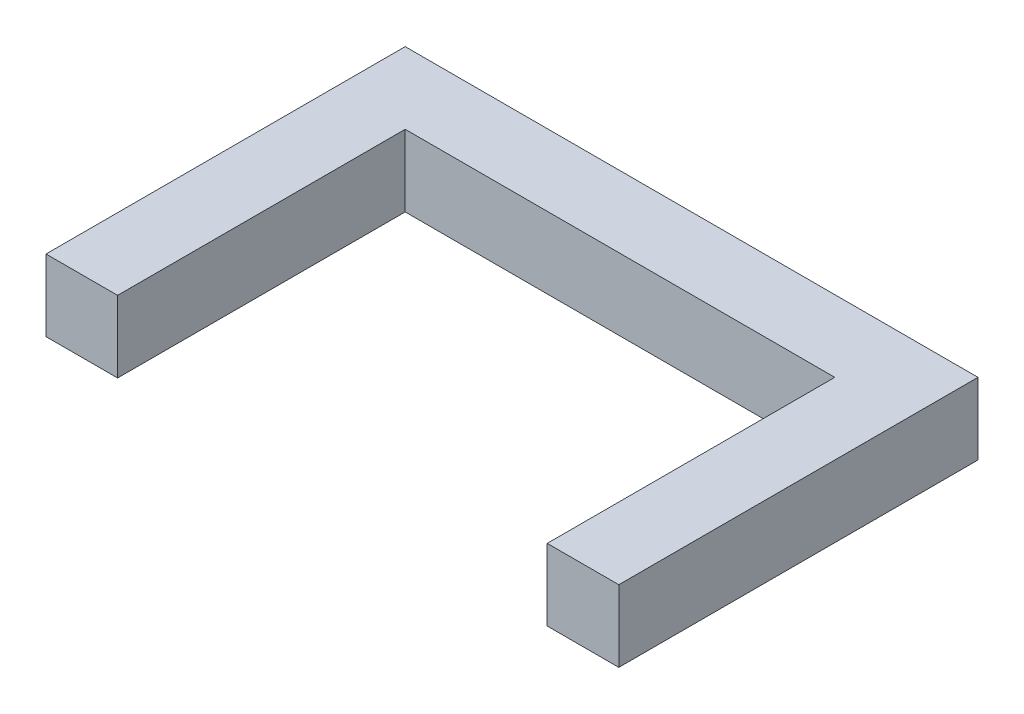
ISO-10303-21;
HEADER;
FILE_DESCRIPTION(('STEP AP214'),'2;1');
FILE_NAME('part.step','',(''),(''),'','','');
FILE_SCHEMA(('AUTOMOTIVE_DESIGN { 1 0 10303 214 1 1 1 1 }'));
ENDSEC;
DATA;
#1=APPLICATION_CONTEXT('core data for automotive mechanical design processes');
#2=APPLICATION_PROTOCOL_DEFINITION('international standard','automotive_design',2000,#1);
#3=PRODUCT_CONTEXT('',#1,'mechanical');
#4=PRODUCT('Part','Part','',(#3));
#5=PRODUCT_RELATED_PRODUCT_CATEGORY('part','',(#4));
#6=PRODUCT_DEFINITION_FORMATION('','',#4);
#7=PRODUCT_DEFINITION_CONTEXT('part definition',#1,'design');
#8=PRODUCT_DEFINITION('design','',#6,#7);
#9=PRODUCT_DEFINITION_SHAPE('','',#8);
#10=(LENGTH_UNIT() NAMED_UNIT(*) SI_UNIT(.MILLI.,.METRE.));
#11=(NAMED_UNIT(*) PLANE_ANGLE_UNIT() SI_UNIT($,.RADIAN.));
#12=(NAMED_UNIT(*) SI_UNIT($,.STERADIAN.) SOLID_ANGLE_UNIT());
#13=UNCERTAINTY_MEASURE_WITH_UNIT(LENGTH_MEASURE(1.E-05),#10,'distance_accuracy_value','');
#14=(GEOMETRIC_REPRESENTATION_CONTEXT(3) GLOBAL_UNCERTAINTY_ASSIGNED_CONTEXT((#13)) GLOBAL_UNIT_ASSIGNED_CONTEXT((#10,
#11,#12)) REPRESENTATION_CONTEXT('',''));
#15=CARTESIAN_POINT('',(0.,0.,0.));
#16=DIRECTION('',(0.,0.,1.));
#17=DIRECTION('',(1.,0.,0.));
#18=AXIS2_PLACEMENT_3D('',#15,#16,#17);
#19=CARTESIAN_POINT('',(4.,4.,0.));
#20=DIRECTION('',(0.,0.,-1.));
#21=DIRECTION('',(-1.,0.,0.));
#22=AXIS2_PLACEMENT_3D('',#19,#20,#21);
#23=PLANE('',#22);
#24=DIRECTION('',(1.,0.,0.));
#25=VECTOR('',#24,1.);
#26=CARTESIAN_POINT('',(4.,0.,0.));
#27=LINE('',#26,#25);
#28=CARTESIAN_POINT('',(0.,0.,0.));
#29=VERTEX_POINT('',#28);
#30=CARTESIAN_POINT('',(4.,0.,0.));
#31=VERTEX_POINT('',#30);
#32=EDGE_CURVE('E134',#29,#31,#27,.T.);
#33=ORIENTED_EDGE('',*,*,#32,.T.);
#34=DIRECTION('',(0.,-1.,0.));
#35=VECTOR('',#34,1.);
#36=CARTESIAN_POINT('',(4.,4.,0.));
#37=LINE('',#36,#35);
#38=CARTESIAN_POINT('',(4.,4.,0.));
#39=VERTEX_POINT('',#38);
#40=EDGE_CURVE('E11',#39,#31,#37,.T.);
#41=ORIENTED_EDGE('',*,*,#40,.F.);
#42=DIRECTION('',(1.,0.,0.));
#43=VECTOR('',#42,1.);
#44=CARTESIAN_POINT('',(4.,4.,0.));
#45=LINE('',#44,#43);
#46=CARTESIAN_POINT('',(0.,4.,0.));
#47=VERTEX_POINT('',#46);
#48=EDGE_CURVE('E146',#47,#39,#45,.T.);
#49=ORIENTED_EDGE('',*,*,#48,.F.);
#50=DIRECTION('',(0.,-1.,0.));
#51=VECTOR('',#50,1.);
#52=CARTESIAN_POINT('',(0.,4.,0.));
#53=LINE('',#52,#51);
#54=EDGE_CURVE('E131',#47,#29,#53,.T.);
#55=ORIENTED_EDGE('',*,*,#54,.T.);
#56=EDGE_LOOP('',(#33,#41,#49,#55));
#57=FACE_BOUND('',#56,.T.);
#58=ADVANCED_FACE('F39',(#57),#23,.F.);
#59=CARTESIAN_POINT('',(4.,4.,-16.066));
#60=DIRECTION('',(-1.,0.,0.));
#61=DIRECTION('',(0.,0.,1.));
#62=AXIS2_PLACEMENT_3D('',#59,#60,#61);
#63=PLANE('',#62);
#64=DIRECTION('',(0.,0.,-1.));
#65=VECTOR('',#64,1.);
#66=CARTESIAN_POINT('',(4.,0.,-16.066));
#67=LINE('',#66,#65);
#68=CARTESIAN_POINT('',(4.,0.,-16.066));
#69=VERTEX_POINT('',#68);
#70=EDGE_CURVE('E138',#31,#69,#67,.T.);
#71=ORIENTED_EDGE('',*,*,#70,.T.);
#72=DIRECTION('',(0.,-1.,0.));
#73=VECTOR('',#72,1.);
#74=CARTESIAN_POINT('',(4.,4.,-16.066));
#75=LINE('',#74,#73);
#76=CARTESIAN_POINT('',(4.,4.,-16.066));
#77=VERTEX_POINT('',#76);
#78=EDGE_CURVE('E50',#77,#69,#75,.T.);
#79=ORIENTED_EDGE('',*,*,#78,.F.);
#80=DIRECTION('',(0.,0.,-1.));
#81=VECTOR('',#80,1.);
#82=CARTESIAN_POINT('',(4.,4.,-16.066));
#83=LINE('',#82,#81);
#84=EDGE_CURVE('E97',#39,#77,#83,.T.);
#85=ORIENTED_EDGE('',*,*,#84,.F.);
#86=ORIENTED_EDGE('',*,*,#40,.T.);
#87=EDGE_LOOP('',(#71,#79,#85,#86));
#88=FACE_BOUND('',#87,.T.);
#89=ADVANCED_FACE('F182',(#88),#63,.F.);
#90=CARTESIAN_POINT('',(28.,4.,-16.066));
#91=DIRECTION('',(0.,0.,-1.));
#92=DIRECTION('',(-1.,0.,0.));
#93=AXIS2_PLACEMENT_3D('',#90,#91,#92);
#94=PLANE('',#93);
#95=DIRECTION('',(1.,0.,0.));
#96=VECTOR('',#95,1.);
#97=CARTESIAN_POINT('',(28.,0.,-16.066));
#98=LINE('',#97,#96);
#99=CARTESIAN_POINT('',(28.,0.,-16.066));
#100=VERTEX_POINT('',#99);
#101=EDGE_CURVE('E139',#69,#100,#98,.T.);
#102=ORIENTED_EDGE('',*,*,#101,.T.);
#103=DIRECTION('',(0.,-1.,0.));
#104=VECTOR('',#103,1.);
#105=CARTESIAN_POINT('',(28.,4.,-16.066));
#106=LINE('',#105,#104);
#107=CARTESIAN_POINT('',(28.,4.,-16.066));
#108=VERTEX_POINT('',#107);
#109=EDGE_CURVE('E157',#108,#100,#106,.T.);
#110=ORIENTED_EDGE('',*,*,#109,.F.);
#111=DIRECTION('',(1.,0.,0.));
#112=VECTOR('',#111,1.);
#113=CARTESIAN_POINT('',(28.,4.,-16.066));
#114=LINE('',#113,#112);
#115=EDGE_CURVE('E163',#77,#108,#114,.T.);
#116=ORIENTED_EDGE('',*,*,#115,.F.);
#117=ORIENTED_EDGE('',*,*,#78,.T.);
#118=EDGE_LOOP('',(#102,#110,#116,#117));
#119=FACE_BOUND('',#118,.T.);
#120=ADVANCED_FACE('F162',(#119),#94,.F.);
#121=CARTESIAN_POINT('',(28.,4.,0.));
#122=DIRECTION('',(1.,0.,0.));
#123=DIRECTION('',(0.,0.,-1.));
#124=AXIS2_PLACEMENT_3D('',#121,#122,#123);
#125=PLANE('',#124);
#126=DIRECTION('',(0.,0.,1.));
#127=VECTOR('',#126,1.);
#128=CARTESIAN_POINT('',(28.,0.,0.));
#129=LINE('',#128,#127);
#130=CARTESIAN_POINT('',(28.,0.,0.));
#131=VERTEX_POINT('',#130);
#132=EDGE_CURVE('E145',#100,#131,#129,.T.);
#133=ORIENTED_EDGE('',*,*,#132,.T.);
#134=DIRECTION('',(0.,-1.,0.));
#135=VECTOR('',#134,1.);
#136=CARTESIAN_POINT('',(28.,4.,0.));
#137=LINE('',#136,#135);
#138=CARTESIAN_POINT('',(28.,4.,0.));
#139=VERTEX_POINT('',#138);
#140=EDGE_CURVE('E154',#139,#131,#137,.T.);
#141=ORIENTED_EDGE('',*,*,#140,.F.);
#142=DIRECTION('',(0.,0.,1.));
#143=VECTOR('',#142,1.);
#144=CARTESIAN_POINT('',(28.,4.,0.));
#145=LINE('',#144,#143);
#146=EDGE_CURVE('E176',#108,#139,#145,.T.);
#147=ORIENTED_EDGE('',*,*,#146,.F.);
#148=ORIENTED_EDGE('',*,*,#109,.T.);
#149=EDGE_LOOP('',(#133,#141,#147,#148));
#150=FACE_BOUND('',#149,.T.);
#151=ADVANCED_FACE('F175',(#150),#125,.F.);
#152=CARTESIAN_POINT('',(32.,4.,0.));
#153=DIRECTION('',(0.,0.,-1.));
#154=DIRECTION('',(-1.,0.,0.));
#155=AXIS2_PLACEMENT_3D('',#152,#153,#154);
#156=PLANE('',#155);
#157=DIRECTION('',(1.,0.,0.));
#158=VECTOR('',#157,1.);
#159=CARTESIAN_POINT('',(32.,0.,0.));
#160=LINE('',#159,#158);
#161=CARTESIAN_POINT('',(32.,0.,0.));
#162=VERTEX_POINT('',#161);
#163=EDGE_CURVE('E143',#131,#162,#160,.T.);
#164=ORIENTED_EDGE('',*,*,#163,.T.);
#165=DIRECTION('',(0.,-1.,0.));
#166=VECTOR('',#165,1.);
#167=CARTESIAN_POINT('',(32.,4.,0.));
#168=LINE('',#167,#166);
#169=CARTESIAN_POINT('',(32.,4.,0.));
#170=VERTEX_POINT('',#169);
#171=EDGE_CURVE('E128',#170,#162,#168,.T.);
#172=ORIENTED_EDGE('',*,*,#171,.F.);
#173=DIRECTION('',(1.,0.,0.));
#174=VECTOR('',#173,1.);
#175=CARTESIAN_POINT('',(32.,4.,0.));
#176=LINE('',#175,#174);
#177=EDGE_CURVE('E117',#139,#170,#176,.T.);
#178=ORIENTED_EDGE('',*,*,#177,.F.);
#179=ORIENTED_EDGE('',*,*,#140,.T.);
#180=EDGE_LOOP('',(#164,#172,#178,#179));
#181=FACE_BOUND('',#180,.T.);
#182=ADVANCED_FACE('F172',(#181),#156,.F.);
#183=CARTESIAN_POINT('',(32.,4.,-20.066));
#184=DIRECTION('',(-1.,0.,0.));
#185=DIRECTION('',(0.,0.,1.));
#186=AXIS2_PLACEMENT_3D('',#183,#184,#185);
#187=PLANE('',#186);
#188=DIRECTION('',(0.,0.,-1.));
#189=VECTOR('',#188,1.);
#190=CARTESIAN_POINT('',(32.,0.,-20.066));
#191=LINE('',#190,#189);
#192=CARTESIAN_POINT('',(32.,0.,-20.066));
#193=VERTEX_POINT('',#192);
#194=EDGE_CURVE('E124',#162,#193,#191,.T.);
#195=ORIENTED_EDGE('',*,*,#194,.T.);
#196=DIRECTION('',(0.,-1.,0.));
#197=VECTOR('',#196,1.);
#198=CARTESIAN_POINT('',(32.,4.,-20.066));
#199=LINE('',#198,#197);
#200=CARTESIAN_POINT('',(32.,4.,-20.066));
#201=VERTEX_POINT('',#200);
#202=EDGE_CURVE('E122',#201,#193,#199,.T.);
#203=ORIENTED_EDGE('',*,*,#202,.F.);
#204=DIRECTION('',(0.,0.,-1.));
#205=VECTOR('',#204,1.);
#206=CARTESIAN_POINT('',(32.,4.,-20.066));
#207=LINE('',#206,#205);
#208=EDGE_CURVE('E112',#170,#201,#207,.T.);
#209=ORIENTED_EDGE('',*,*,#208,.F.);
#210=ORIENTED_EDGE('',*,*,#171,.T.);
#211=EDGE_LOOP('',(#195,#203,#209,#210));
#212=FACE_BOUND('',#211,.T.);
#213=ADVANCED_FACE('F121',(#212),#187,.F.);
#214=CARTESIAN_POINT('',(0.,4.,-20.066));
#215=DIRECTION('',(0.,0.,1.));
#216=DIRECTION('',(1.,0.,0.));
#217=AXIS2_PLACEMENT_3D('',#214,#215,#216);
#218=PLANE('',#217);
#219=DIRECTION('',(-1.,0.,0.));
#220=VECTOR('',#219,1.);
#221=CARTESIAN_POINT('',(0.,0.,-20.066));
#222=LINE('',#221,#220);
#223=CARTESIAN_POINT('',(0.,0.,-20.066));
#224=VERTEX_POINT('',#223);
#225=EDGE_CURVE('E84',#193,#224,#222,.T.);
#226=ORIENTED_EDGE('',*,*,#225,.T.);
#227=DIRECTION('',(0.,-1.,0.));
#228=VECTOR('',#227,1.);
#229=CARTESIAN_POINT('',(0.,4.,-20.066));
#230=LINE('',#229,#228);
#231=CARTESIAN_POINT('',(0.,4.,-20.066));
#232=VERTEX_POINT('',#231);
#233=EDGE_CURVE('E130',#232,#224,#230,.T.);
#234=ORIENTED_EDGE('',*,*,#233,.F.);
#235=DIRECTION('',(-1.,0.,0.));
#236=VECTOR('',#235,1.);
#237=CARTESIAN_POINT('',(0.,4.,-20.066));
#238=LINE('',#237,#236);
#239=EDGE_CURVE('E113',#201,#232,#238,.T.);
#240=ORIENTED_EDGE('',*,*,#239,.F.);
#241=ORIENTED_EDGE('',*,*,#202,.T.);
#242=EDGE_LOOP('',(#226,#234,#240,#241));
#243=FACE_BOUND('',#242,.T.);
#244=ADVANCED_FACE('F129',(#243),#218,.F.);
#245=CARTESIAN_POINT('',(0.,4.,0.));
#246=DIRECTION('',(1.,0.,0.));
#247=DIRECTION('',(0.,0.,-1.));
#248=AXIS2_PLACEMENT_3D('',#245,#246,#247);
#249=PLANE('',#248);
#250=DIRECTION('',(0.,0.,1.));
#251=VECTOR('',#250,1.);
#252=CARTESIAN_POINT('',(0.,0.,0.));
#253=LINE('',#252,#251);
#254=EDGE_CURVE('E89',#224,#29,#253,.T.);
#255=ORIENTED_EDGE('',*,*,#254,.T.);
#256=ORIENTED_EDGE('',*,*,#54,.F.);
#257=DIRECTION('',(0.,0.,1.));
#258=VECTOR('',#257,1.);
#259=CARTESIAN_POINT('',(0.,4.,0.));
#260=LINE('',#259,#258);
#261=EDGE_CURVE('E54',#232,#47,#260,.T.);
#262=ORIENTED_EDGE('',*,*,#261,.F.);
#263=ORIENTED_EDGE('',*,*,#233,.T.);
#264=EDGE_LOOP('',(#255,#256,#262,#263));
#265=FACE_BOUND('',#264,.T.);
#266=ADVANCED_FACE('F200',(#265),#249,.F.);
#267=CARTESIAN_POINT('',(0.,4.,0.));
#268=DIRECTION('',(0.,-1.,0.));
#269=DIRECTION('',(0.,0.,-1.));
#270=AXIS2_PLACEMENT_3D('',#267,#268,#269);
#271=PLANE('',#270);
#272=ORIENTED_EDGE('',*,*,#48,.T.);
#273=ORIENTED_EDGE('',*,*,#84,.T.);
#274=ORIENTED_EDGE('',*,*,#115,.T.);
#275=ORIENTED_EDGE('',*,*,#146,.T.);
#276=ORIENTED_EDGE('',*,*,#177,.T.);
#277=ORIENTED_EDGE('',*,*,#208,.T.);
#278=ORIENTED_EDGE('',*,*,#239,.T.);
#279=ORIENTED_EDGE('',*,*,#261,.T.);
#280=EDGE_LOOP('',(#272,#273,#274,#275,#276,#277,#278,#279));
#281=FACE_BOUND('',#280,.T.);
#282=ADVANCED_FACE('F111',(#281),#271,.F.);
#283=CARTESIAN_POINT('',(0.,0.,0.));
#284=DIRECTION('',(0.,-1.,0.));
#285=DIRECTION('',(0.,0.,-1.));
#286=AXIS2_PLACEMENT_3D('',#283,#284,#285);
#287=PLANE('',#286);
#288=ORIENTED_EDGE('',*,*,#32,.F.);
#289=ORIENTED_EDGE('',*,*,#254,.F.);
#290=ORIENTED_EDGE('',*,*,#225,.F.);
#291=ORIENTED_EDGE('',*,*,#194,.F.);
#292=ORIENTED_EDGE('',*,*,#163,.F.);
#293=ORIENTED_EDGE('',*,*,#132,.F.);
#294=ORIENTED_EDGE('',*,*,#101,.F.);
#295=ORIENTED_EDGE('',*,*,#70,.F.);
#296=EDGE_LOOP('',(#288,#289,#290,#291,#292,#293,#294,#295));
#297=FACE_BOUND('',#296,.T.);
#298=ADVANCED_FACE('F166',(#297),#287,.T.);
#299=CLOSED_SHELL('',(#58,#89,#120,#151,#182,#213,#244,#266,#282,#298));
#300=MANIFOLD_SOLID_BREP('B2',#299);
#301=ADVANCED_BREP_SHAPE_REPRESENTATION('',(#18,#300),#14);
#302=SHAPE_DEFINITION_REPRESENTATION(#9,#301);
ENDSEC;
END-ISO-10303-21;
